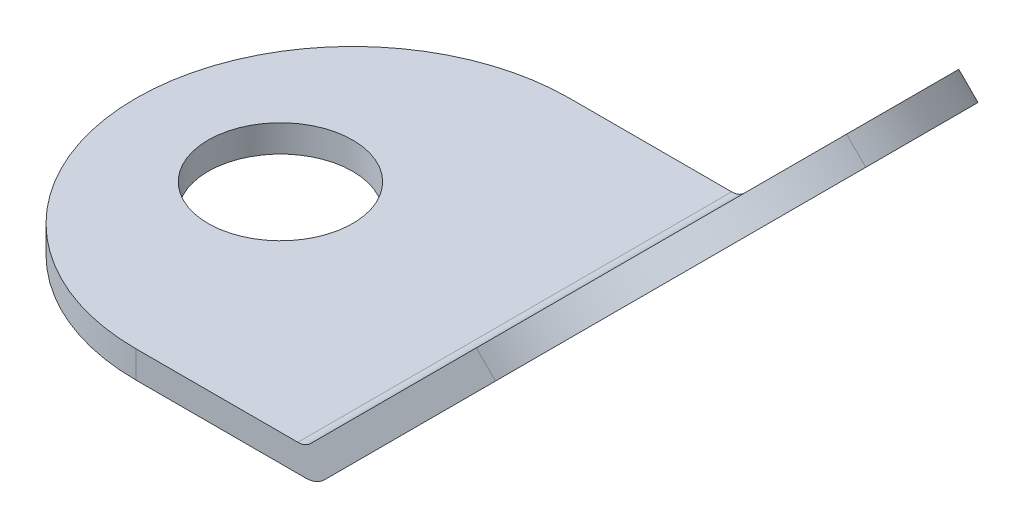
ISO-10303-21;
HEADER;
FILE_DESCRIPTION(('STEP AP214'),'2;1');
FILE_NAME('part.step','',(''),(''),'','','');
FILE_SCHEMA(('AUTOMOTIVE_DESIGN { 1 0 10303 214 1 1 1 1 }'));
ENDSEC;
DATA;
#1=APPLICATION_CONTEXT('core data for automotive mechanical design processes');
#2=APPLICATION_PROTOCOL_DEFINITION('international standard','automotive_design',2000,#1);
#3=PRODUCT_CONTEXT('',#1,'mechanical');
#4=PRODUCT('Part','Part','',(#3));
#5=PRODUCT_RELATED_PRODUCT_CATEGORY('part','',(#4));
#6=PRODUCT_DEFINITION_FORMATION('','',#4);
#7=PRODUCT_DEFINITION_CONTEXT('part definition',#1,'design');
#8=PRODUCT_DEFINITION('design','',#6,#7);
#9=PRODUCT_DEFINITION_SHAPE('','',#8);
#10=(LENGTH_UNIT() NAMED_UNIT(*) SI_UNIT(.MILLI.,.METRE.));
#11=(NAMED_UNIT(*) PLANE_ANGLE_UNIT() SI_UNIT($,.RADIAN.));
#12=(NAMED_UNIT(*) SI_UNIT($,.STERADIAN.) SOLID_ANGLE_UNIT());
#13=UNCERTAINTY_MEASURE_WITH_UNIT(LENGTH_MEASURE(1.E-05),#10,'distance_accuracy_value','');
#14=(GEOMETRIC_REPRESENTATION_CONTEXT(3) GLOBAL_UNCERTAINTY_ASSIGNED_CONTEXT((#13)) GLOBAL_UNIT_ASSIGNED_CONTEXT((#10,
#11,#12)) REPRESENTATION_CONTEXT('',''));
#15=CARTESIAN_POINT('',(0.,0.,0.));
#16=DIRECTION('',(0.,0.,1.));
#17=DIRECTION('',(1.,0.,0.));
#18=AXIS2_PLACEMENT_3D('',#15,#16,#17);
#19=CARTESIAN_POINT('',(0.,0.75,6.));
#20=DIRECTION('',(0.,-1.,0.));
#21=DIRECTION('',(1.,0.,0.));
#22=AXIS2_PLACEMENT_3D('',#19,#20,#21);
#23=PLANE('',#22);
#24=CARTESIAN_POINT('',(-7.,0.749999999999999,0.));
#25=DIRECTION('',(0.,1.,0.));
#26=DIRECTION('',(-1.,0.,0.));
#27=AXIS2_PLACEMENT_3D('',#24,#25,#26);
#28=CIRCLE('',#27,2.);
#29=CARTESIAN_POINT('',(-9.,0.749999999999999,0.));
#30=VERTEX_POINT('',#29);
#31=EDGE_CURVE('E190',#30,#30,#28,.T.);
#32=ORIENTED_EDGE('',*,*,#31,.F.);
#33=EDGE_LOOP('',(#32));
#34=FACE_BOUND('',#33,.T.);
#35=DIRECTION('',(-1.,0.,0.));
#36=VECTOR('',#35,1.);
#37=CARTESIAN_POINT('',(0.,0.75,6.));
#38=LINE('',#37,#36);
#39=CARTESIAN_POINT('',(-0.517766952966369,0.75,6.));
#40=VERTEX_POINT('',#39);
#41=CARTESIAN_POINT('',(-5.,0.749999999999999,6.));
#42=VERTEX_POINT('',#41);
#43=EDGE_CURVE('E199',#40,#42,#38,.T.);
#44=ORIENTED_EDGE('',*,*,#43,.F.);
#45=DIRECTION('',(0.,0.,-1.));
#46=VECTOR('',#45,1.);
#47=CARTESIAN_POINT('',(-0.517766952966369,0.75,-6.));
#48=LINE('',#47,#46);
#49=CARTESIAN_POINT('',(-0.517766952966369,0.75,-6.));
#50=VERTEX_POINT('',#49);
#51=EDGE_CURVE('E286',#40,#50,#48,.T.);
#52=ORIENTED_EDGE('',*,*,#51,.T.);
#53=DIRECTION('',(-1.,0.,0.));
#54=VECTOR('',#53,1.);
#55=CARTESIAN_POINT('',(0.,0.75,-6.));
#56=LINE('',#55,#54);
#57=CARTESIAN_POINT('',(-5.,0.749999999999999,-6.));
#58=VERTEX_POINT('',#57);
#59=EDGE_CURVE('E214',#50,#58,#56,.T.);
#60=ORIENTED_EDGE('',*,*,#59,.T.);
#61=CARTESIAN_POINT('',(-5.,0.749999999999999,0.));
#62=DIRECTION('',(0.,-1.,0.));
#63=DIRECTION('',(1.,0.,0.));
#64=AXIS2_PLACEMENT_3D('',#61,#62,#63);
#65=CIRCLE('',#64,6.);
#66=CARTESIAN_POINT('',(-11.,0.749999999999999,0.));
#67=VERTEX_POINT('',#66);
#68=EDGE_CURVE('E213',#58,#67,#65,.F.);
#69=ORIENTED_EDGE('',*,*,#68,.T.);
#70=CARTESIAN_POINT('',(-5.,0.749999999999999,0.));
#71=DIRECTION('',(0.,-1.,0.));
#72=DIRECTION('',(1.,0.,0.));
#73=AXIS2_PLACEMENT_3D('',#70,#71,#72);
#74=CIRCLE('',#73,6.);
#75=EDGE_CURVE('E229',#67,#42,#74,.F.);
#76=ORIENTED_EDGE('',*,*,#75,.T.);
#77=EDGE_LOOP('',(#44,#52,#60,#69,#76));
#78=FACE_BOUND('',#77,.T.);
#79=ADVANCED_FACE('F39',(#34,#78),#23,.F.);
#80=CARTESIAN_POINT('',(0.,0.,6.));
#81=DIRECTION('',(0.,-1.,0.));
#82=DIRECTION('',(1.,0.,0.));
#83=AXIS2_PLACEMENT_3D('',#80,#81,#82);
#84=PLANE('',#83);
#85=CARTESIAN_POINT('',(-7.,0.,0.));
#86=DIRECTION('',(0.,-1.,0.));
#87=DIRECTION('',(1.,0.,0.));
#88=AXIS2_PLACEMENT_3D('',#85,#86,#87);
#89=CIRCLE('',#88,2.);
#90=CARTESIAN_POINT('',(-5.,0.,0.));
#91=VERTEX_POINT('',#90);
#92=EDGE_CURVE('E194',#91,#91,#89,.F.);
#93=ORIENTED_EDGE('',*,*,#92,.T.);
#94=EDGE_LOOP('',(#93));
#95=FACE_BOUND('',#94,.T.);
#96=DIRECTION('',(-1.,0.,0.));
#97=VECTOR('',#96,1.);
#98=CARTESIAN_POINT('',(0.,0.,-6.));
#99=LINE('',#98,#97);
#100=CARTESIAN_POINT('',(-0.31066017177982,0.,-6.));
#101=VERTEX_POINT('',#100);
#102=CARTESIAN_POINT('',(-5.,0.,-6.));
#103=VERTEX_POINT('',#102);
#104=EDGE_CURVE('E217',#101,#103,#99,.T.);
#105=ORIENTED_EDGE('',*,*,#104,.F.);
#106=DIRECTION('',(0.,0.,-1.));
#107=VECTOR('',#106,1.);
#108=CARTESIAN_POINT('',(-0.31066017177982,0.,6.));
#109=LINE('',#108,#107);
#110=CARTESIAN_POINT('',(-0.31066017177982,0.,6.));
#111=VERTEX_POINT('',#110);
#112=EDGE_CURVE('E280',#101,#111,#109,.F.);
#113=ORIENTED_EDGE('',*,*,#112,.T.);
#114=DIRECTION('',(-1.,0.,0.));
#115=VECTOR('',#114,1.);
#116=CARTESIAN_POINT('',(0.,0.,6.));
#117=LINE('',#116,#115);
#118=CARTESIAN_POINT('',(-5.,0.,6.));
#119=VERTEX_POINT('',#118);
#120=EDGE_CURVE('E202',#111,#119,#117,.T.);
#121=ORIENTED_EDGE('',*,*,#120,.T.);
#122=CARTESIAN_POINT('',(-5.,0.,0.));
#123=DIRECTION('',(0.,-1.,0.));
#124=DIRECTION('',(1.,0.,0.));
#125=AXIS2_PLACEMENT_3D('',#122,#123,#124);
#126=CIRCLE('',#125,6.);
#127=CARTESIAN_POINT('',(-11.,0.,0.));
#128=VERTEX_POINT('',#127);
#129=EDGE_CURVE('E244',#119,#128,#126,.T.);
#130=ORIENTED_EDGE('',*,*,#129,.T.);
#131=CARTESIAN_POINT('',(-5.,0.,0.));
#132=DIRECTION('',(0.,-1.,0.));
#133=DIRECTION('',(1.,0.,0.));
#134=AXIS2_PLACEMENT_3D('',#131,#132,#133);
#135=CIRCLE('',#134,6.);
#136=EDGE_CURVE('E240',#128,#103,#135,.T.);
#137=ORIENTED_EDGE('',*,*,#136,.T.);
#138=EDGE_LOOP('',(#105,#113,#121,#130,#137));
#139=FACE_BOUND('',#138,.T.);
#140=ADVANCED_FACE('F322',(#95,#139),#84,.T.);
#141=CARTESIAN_POINT('',(9.1923881554251,9.19238815542514,6.));
#142=DIRECTION('',(0.707106781186549,-0.707106781186546,0.));
#143=DIRECTION('',(0.707106781186546,0.707106781186549,0.));
#144=AXIS2_PLACEMENT_3D('',#141,#142,#143);
#145=PLANE('',#144);
#146=DIRECTION('',(-0.707106781186546,-0.707106781186549,0.));
#147=VECTOR('',#146,1.);
#148=CARTESIAN_POINT('',(6.36396103067891,6.36396103067894,-2.));
#149=LINE('',#148,#147);
#150=CARTESIAN_POINT('',(6.36396103067891,6.36396103067894,-2.));
#151=VERTEX_POINT('',#150);
#152=CARTESIAN_POINT('',(2.47487373415291,2.47487373415292,-2.));
#153=VERTEX_POINT('',#152);
#154=EDGE_CURVE('E156',#151,#153,#149,.T.);
#155=ORIENTED_EDGE('',*,*,#154,.T.);
#156=CARTESIAN_POINT('',(2.47487373415291,2.47487373415292,0.));
#157=DIRECTION('',(0.707106781186549,-0.707106781186546,0.));
#158=DIRECTION('',(0.707106781186546,0.707106781186549,0.));
#159=AXIS2_PLACEMENT_3D('',#156,#157,#158);
#160=CIRCLE('',#159,2.);
#161=CARTESIAN_POINT('',(2.47487373415291,2.47487373415292,2.));
#162=VERTEX_POINT('',#161);
#163=EDGE_CURVE('E141',#153,#162,#160,.F.);
#164=ORIENTED_EDGE('',*,*,#163,.T.);
#165=DIRECTION('',(0.707106781186546,0.707106781186549,0.));
#166=VECTOR('',#165,1.);
#167=CARTESIAN_POINT('',(6.36396103067891,6.36396103067894,2.));
#168=LINE('',#167,#166);
#169=CARTESIAN_POINT('',(6.36396103067891,6.36396103067894,2.));
#170=VERTEX_POINT('',#169);
#171=EDGE_CURVE('E180',#162,#170,#168,.T.);
#172=ORIENTED_EDGE('',*,*,#171,.T.);
#173=CARTESIAN_POINT('',(6.36396103067891,6.36396103067894,0.));
#174=DIRECTION('',(0.707106781186549,-0.707106781186546,0.));
#175=DIRECTION('',(0.707106781186546,0.707106781186549,0.));
#176=AXIS2_PLACEMENT_3D('',#173,#174,#175);
#177=CIRCLE('',#176,2.);
#178=EDGE_CURVE('E165',#170,#151,#177,.F.);
#179=ORIENTED_EDGE('',*,*,#178,.T.);
#180=EDGE_LOOP('',(#155,#164,#172,#179));
#181=FACE_BOUND('',#180,.T.);
#182=DIRECTION('',(-0.707106781186546,-0.707106781186549,0.));
#183=VECTOR('',#182,1.);
#184=CARTESIAN_POINT('',(9.1923881554251,9.19238815542514,6.));
#185=LINE('',#184,#183);
#186=CARTESIAN_POINT('',(4.94974746830582,4.94974746830584,6.));
#187=VERTEX_POINT('',#186);
#188=CARTESIAN_POINT('',(0.219669914110094,0.219669914110094,6.));
#189=VERTEX_POINT('',#188);
#190=EDGE_CURVE('E206',#187,#189,#185,.T.);
#191=ORIENTED_EDGE('',*,*,#190,.T.);
#192=DIRECTION('',(0.,0.,-1.));
#193=VECTOR('',#192,1.);
#194=CARTESIAN_POINT('',(0.219669914110092,0.219669914110092,6.));
#195=LINE('',#194,#193);
#196=CARTESIAN_POINT('',(0.219669914110094,0.219669914110094,-6.));
#197=VERTEX_POINT('',#196);
#198=EDGE_CURVE('E267',#189,#197,#195,.T.);
#199=ORIENTED_EDGE('',*,*,#198,.T.);
#200=DIRECTION('',(-0.707106781186546,-0.707106781186549,0.));
#201=VECTOR('',#200,1.);
#202=CARTESIAN_POINT('',(9.1923881554251,9.19238815542514,-6.));
#203=LINE('',#202,#201);
#204=CARTESIAN_POINT('',(4.94974746830582,4.94974746830584,-6.));
#205=VERTEX_POINT('',#204);
#206=EDGE_CURVE('E221',#205,#197,#203,.T.);
#207=ORIENTED_EDGE('',*,*,#206,.F.);
#208=CARTESIAN_POINT('',(4.94974746830582,4.94974746830584,0.));
#209=DIRECTION('',(0.707106781186549,-0.707106781186546,0.));
#210=DIRECTION('',(0.707106781186546,0.707106781186549,0.));
#211=AXIS2_PLACEMENT_3D('',#208,#209,#210);
#212=CIRCLE('',#211,6.);
#213=CARTESIAN_POINT('',(9.1923881554251,9.19238815542514,0.));
#214=VERTEX_POINT('',#213);
#215=EDGE_CURVE('E258',#205,#214,#212,.T.);
#216=ORIENTED_EDGE('',*,*,#215,.T.);
#217=CARTESIAN_POINT('',(4.94974746830582,4.94974746830584,0.));
#218=DIRECTION('',(0.707106781186549,-0.707106781186546,0.));
#219=DIRECTION('',(0.707106781186546,0.707106781186549,0.));
#220=AXIS2_PLACEMENT_3D('',#217,#218,#219);
#221=CIRCLE('',#220,6.);
#222=EDGE_CURVE('E255',#214,#187,#221,.T.);
#223=ORIENTED_EDGE('',*,*,#222,.T.);
#224=EDGE_LOOP('',(#191,#199,#207,#216,#223));
#225=FACE_BOUND('',#224,.T.);
#226=ADVANCED_FACE('F163',(#181,#225),#145,.T.);
#227=CARTESIAN_POINT('',(8.66205806953518,9.72271824131505,6.));
#228=DIRECTION('',(0.707106781186549,-0.707106781186546,0.));
#229=DIRECTION('',(0.707106781186546,0.707106781186549,0.));
#230=AXIS2_PLACEMENT_3D('',#227,#228,#229);
#231=PLANE('',#230);
#232=CARTESIAN_POINT('',(1.944543648263,3.00520382004283,0.));
#233=DIRECTION('',(-0.707106781186549,0.707106781186546,0.));
#234=DIRECTION('',(-0.707106781186546,-0.707106781186549,0.));
#235=AXIS2_PLACEMENT_3D('',#232,#233,#234);
#236=CIRCLE('',#235,2.);
#237=CARTESIAN_POINT('',(1.944543648263,3.00520382004283,-2.));
#238=VERTEX_POINT('',#237);
#239=CARTESIAN_POINT('',(1.944543648263,3.00520382004283,2.));
#240=VERTEX_POINT('',#239);
#241=EDGE_CURVE('E170',#238,#240,#236,.T.);
#242=ORIENTED_EDGE('',*,*,#241,.F.);
#243=DIRECTION('',(-0.707106781186546,-0.707106781186549,0.));
#244=VECTOR('',#243,1.);
#245=CARTESIAN_POINT('',(5.833630944789,6.89429111656885,-2.));
#246=LINE('',#245,#244);
#247=CARTESIAN_POINT('',(5.833630944789,6.89429111656885,-2.));
#248=VERTEX_POINT('',#247);
#249=EDGE_CURVE('E159',#248,#238,#246,.T.);
#250=ORIENTED_EDGE('',*,*,#249,.F.);
#251=CARTESIAN_POINT('',(5.833630944789,6.89429111656885,0.));
#252=DIRECTION('',(-0.707106781186549,0.707106781186546,0.));
#253=DIRECTION('',(-0.707106781186546,-0.707106781186549,0.));
#254=AXIS2_PLACEMENT_3D('',#251,#252,#253);
#255=CIRCLE('',#254,2.);
#256=CARTESIAN_POINT('',(5.833630944789,6.89429111656885,2.));
#257=VERTEX_POINT('',#256);
#258=EDGE_CURVE('E174',#257,#248,#255,.T.);
#259=ORIENTED_EDGE('',*,*,#258,.F.);
#260=DIRECTION('',(0.707106781186546,0.707106781186549,0.));
#261=VECTOR('',#260,1.);
#262=CARTESIAN_POINT('',(5.833630944789,6.89429111656885,2.));
#263=LINE('',#262,#261);
#264=EDGE_CURVE('E167',#240,#257,#263,.T.);
#265=ORIENTED_EDGE('',*,*,#264,.F.);
#266=EDGE_LOOP('',(#242,#250,#259,#265));
#267=FACE_BOUND('',#266,.T.);
#268=DIRECTION('',(-0.707106781186546,-0.707106781186549,0.));
#269=VECTOR('',#268,1.);
#270=CARTESIAN_POINT('',(8.66205806953518,9.72271824131505,-6.));
#271=LINE('',#270,#269);
#272=CARTESIAN_POINT('',(4.41941738241591,5.48007755419575,-6.));
#273=VERTEX_POINT('',#272);
#274=CARTESIAN_POINT('',(-0.164213562373096,0.896446609406727,-6.));
#275=VERTEX_POINT('',#274);
#276=EDGE_CURVE('E203',#273,#275,#271,.T.);
#277=ORIENTED_EDGE('',*,*,#276,.T.);
#278=DIRECTION('',(0.,0.,-1.));
#279=VECTOR('',#278,1.);
#280=CARTESIAN_POINT('',(-0.164213562373094,0.896446609406727,6.));
#281=LINE('',#280,#279);
#282=CARTESIAN_POINT('',(-0.164213562373096,0.896446609406727,6.));
#283=VERTEX_POINT('',#282);
#284=EDGE_CURVE('E55',#275,#283,#281,.F.);
#285=ORIENTED_EDGE('',*,*,#284,.T.);
#286=DIRECTION('',(-0.707106781186546,-0.707106781186549,0.));
#287=VECTOR('',#286,1.);
#288=CARTESIAN_POINT('',(8.66205806953518,9.72271824131505,6.));
#289=LINE('',#288,#287);
#290=CARTESIAN_POINT('',(4.41941738241591,5.48007755419575,6.));
#291=VERTEX_POINT('',#290);
#292=EDGE_CURVE('E210',#291,#283,#289,.T.);
#293=ORIENTED_EDGE('',*,*,#292,.F.);
#294=CARTESIAN_POINT('',(4.41941738241591,5.48007755419575,0.));
#295=DIRECTION('',(0.707106781186549,-0.707106781186546,0.));
#296=DIRECTION('',(0.707106781186546,0.707106781186549,0.));
#297=AXIS2_PLACEMENT_3D('',#294,#295,#296);
#298=CIRCLE('',#297,6.);
#299=CARTESIAN_POINT('',(8.66205806953518,9.72271824131505,0.));
#300=VERTEX_POINT('',#299);
#301=EDGE_CURVE('E261',#291,#300,#298,.F.);
#302=ORIENTED_EDGE('',*,*,#301,.T.);
#303=CARTESIAN_POINT('',(4.41941738241591,5.48007755419575,0.));
#304=DIRECTION('',(0.707106781186549,-0.707106781186546,0.));
#305=DIRECTION('',(0.707106781186546,0.707106781186549,0.));
#306=AXIS2_PLACEMENT_3D('',#303,#304,#305);
#307=CIRCLE('',#306,6.);
#308=EDGE_CURVE('E264',#300,#273,#307,.F.);
#309=ORIENTED_EDGE('',*,*,#308,.T.);
#310=EDGE_LOOP('',(#277,#285,#293,#302,#309));
#311=FACE_BOUND('',#310,.T.);
#312=ADVANCED_FACE('F353',(#267,#311),#231,.F.);
#313=CARTESIAN_POINT('',(0.,0.,6.));
#314=DIRECTION('',(0.,0.,-1.));
#315=DIRECTION('',(-1.,0.,0.));
#316=AXIS2_PLACEMENT_3D('',#313,#314,#315);
#317=PLANE('',#316);
#318=ORIENTED_EDGE('',*,*,#120,.F.);
#319=CARTESIAN_POINT('',(-0.31066017177982,0.750000000000001,6.));
#320=DIRECTION('',(0.,0.,-1.));
#321=DIRECTION('',(-1.,0.,0.));
#322=AXIS2_PLACEMENT_3D('',#319,#320,#321);
#323=CIRCLE('',#322,0.75);
#324=EDGE_CURVE('E283',#111,#189,#323,.F.);
#325=ORIENTED_EDGE('',*,*,#324,.T.);
#326=ORIENTED_EDGE('',*,*,#190,.F.);
#327=DIRECTION('',(0.70710678118655,-0.707106781186545,0.));
#328=VECTOR('',#327,1.);
#329=CARTESIAN_POINT('',(4.41941738241591,5.48007755419575,6.));
#330=LINE('',#329,#328);
#331=EDGE_CURVE('E233',#187,#291,#330,.F.);
#332=ORIENTED_EDGE('',*,*,#331,.T.);
#333=ORIENTED_EDGE('',*,*,#292,.T.);
#334=CARTESIAN_POINT('',(-0.517766952966369,1.25,6.));
#335=DIRECTION('',(0.,0.,-1.));
#336=DIRECTION('',(-1.,0.,0.));
#337=AXIS2_PLACEMENT_3D('',#334,#335,#336);
#338=CIRCLE('',#337,0.5);
#339=EDGE_CURVE('E11',#283,#40,#338,.T.);
#340=ORIENTED_EDGE('',*,*,#339,.T.);
#341=ORIENTED_EDGE('',*,*,#43,.T.);
#342=DIRECTION('',(0.,1.,0.));
#343=VECTOR('',#342,1.);
#344=CARTESIAN_POINT('',(-5.,0.,6.));
#345=LINE('',#344,#343);
#346=EDGE_CURVE('E236',#42,#119,#345,.F.);
#347=ORIENTED_EDGE('',*,*,#346,.T.);
#348=EDGE_LOOP('',(#318,#325,#326,#332,#333,#340,#341,#347));
#349=FACE_BOUND('',#348,.T.);
#350=ADVANCED_FACE('F312',(#349),#317,.F.);
#351=CARTESIAN_POINT('',(0.,0.,-6.));
#352=DIRECTION('',(0.,0.,-1.));
#353=DIRECTION('',(-1.,0.,0.));
#354=AXIS2_PLACEMENT_3D('',#351,#352,#353);
#355=PLANE('',#354);
#356=ORIENTED_EDGE('',*,*,#206,.T.);
#357=CARTESIAN_POINT('',(-0.31066017177982,0.750000000000001,-6.));
#358=DIRECTION('',(0.,0.,-1.));
#359=DIRECTION('',(-1.,0.,0.));
#360=AXIS2_PLACEMENT_3D('',#357,#358,#359);
#361=CIRCLE('',#360,0.75);
#362=EDGE_CURVE('E277',#197,#101,#361,.T.);
#363=ORIENTED_EDGE('',*,*,#362,.T.);
#364=ORIENTED_EDGE('',*,*,#104,.T.);
#365=DIRECTION('',(0.,1.,0.));
#366=VECTOR('',#365,1.);
#367=CARTESIAN_POINT('',(-5.,0.,-6.));
#368=LINE('',#367,#366);
#369=EDGE_CURVE('E251',#103,#58,#368,.T.);
#370=ORIENTED_EDGE('',*,*,#369,.T.);
#371=ORIENTED_EDGE('',*,*,#59,.F.);
#372=CARTESIAN_POINT('',(-0.517766952966369,1.25,-6.));
#373=DIRECTION('',(0.,0.,-1.));
#374=DIRECTION('',(-1.,0.,0.));
#375=AXIS2_PLACEMENT_3D('',#372,#373,#374);
#376=CIRCLE('',#375,0.5);
#377=EDGE_CURVE('E48',#50,#275,#376,.F.);
#378=ORIENTED_EDGE('',*,*,#377,.T.);
#379=ORIENTED_EDGE('',*,*,#276,.F.);
#380=DIRECTION('',(0.70710678118655,-0.707106781186545,0.));
#381=VECTOR('',#380,1.);
#382=CARTESIAN_POINT('',(4.94974746830582,4.94974746830585,-6.));
#383=LINE('',#382,#381);
#384=EDGE_CURVE('E247',#273,#205,#383,.T.);
#385=ORIENTED_EDGE('',*,*,#384,.T.);
#386=EDGE_LOOP('',(#356,#363,#364,#370,#371,#378,#379,#385));
#387=FACE_BOUND('',#386,.T.);
#388=ADVANCED_FACE('F297',(#387),#355,.T.);
#389=CARTESIAN_POINT('',(-5.,0.,0.));
#390=DIRECTION('',(0.,1.,0.));
#391=DIRECTION('',(0.,0.,1.));
#392=AXIS2_PLACEMENT_3D('',#389,#390,#391);
#393=CYLINDRICAL_SURFACE('',#392,6.);
#394=ORIENTED_EDGE('',*,*,#369,.F.);
#395=ORIENTED_EDGE('',*,*,#136,.F.);
#396=DIRECTION('',(0.,1.,0.));
#397=VECTOR('',#396,1.);
#398=CARTESIAN_POINT('',(-11.,0.,0.));
#399=LINE('',#398,#397);
#400=EDGE_CURVE('E218',#67,#128,#399,.F.);
#401=ORIENTED_EDGE('',*,*,#400,.F.);
#402=ORIENTED_EDGE('',*,*,#68,.F.);
#403=EDGE_LOOP('',(#394,#395,#401,#402));
#404=FACE_BOUND('',#403,.T.);
#405=ADVANCED_FACE('F304',(#404),#393,.T.);
#406=CARTESIAN_POINT('',(-5.,0.,0.));
#407=DIRECTION('',(0.,-1.,0.));
#408=DIRECTION('',(0.,0.,-1.));
#409=AXIS2_PLACEMENT_3D('',#406,#407,#408);
#410=CYLINDRICAL_SURFACE('',#409,6.);
#411=ORIENTED_EDGE('',*,*,#129,.F.);
#412=ORIENTED_EDGE('',*,*,#346,.F.);
#413=ORIENTED_EDGE('',*,*,#75,.F.);
#414=ORIENTED_EDGE('',*,*,#400,.T.);
#415=EDGE_LOOP('',(#411,#412,#413,#414));
#416=FACE_BOUND('',#415,.T.);
#417=ADVANCED_FACE('F309',(#416),#410,.T.);
#418=CARTESIAN_POINT('',(4.41941738241591,5.48007755419575,0.));
#419=DIRECTION('',(-0.70710678118655,0.707106781186545,0.));
#420=DIRECTION('',(-0.707106781186545,-0.70710678118655,0.));
#421=AXIS2_PLACEMENT_3D('',#418,#419,#420);
#422=CYLINDRICAL_SURFACE('',#421,6.);
#423=DIRECTION('',(0.70710678118655,-0.707106781186545,0.));
#424=VECTOR('',#423,1.);
#425=CARTESIAN_POINT('',(9.1923881554251,9.19238815542514,0.));
#426=LINE('',#425,#424);
#427=EDGE_CURVE('E198',#300,#214,#426,.T.);
#428=ORIENTED_EDGE('',*,*,#427,.F.);
#429=ORIENTED_EDGE('',*,*,#301,.F.);
#430=ORIENTED_EDGE('',*,*,#331,.F.);
#431=ORIENTED_EDGE('',*,*,#222,.F.);
#432=EDGE_LOOP('',(#428,#429,#430,#431));
#433=FACE_BOUND('',#432,.T.);
#434=ADVANCED_FACE('F335',(#433),#422,.T.);
#435=CARTESIAN_POINT('',(4.94974746830582,4.94974746830585,0.));
#436=DIRECTION('',(0.70710678118655,-0.707106781186545,0.));
#437=DIRECTION('',(0.707106781186545,0.70710678118655,0.));
#438=AXIS2_PLACEMENT_3D('',#435,#436,#437);
#439=CYLINDRICAL_SURFACE('',#438,6.);
#440=ORIENTED_EDGE('',*,*,#308,.F.);
#441=ORIENTED_EDGE('',*,*,#427,.T.);
#442=ORIENTED_EDGE('',*,*,#215,.F.);
#443=ORIENTED_EDGE('',*,*,#384,.F.);
#444=EDGE_LOOP('',(#440,#441,#442,#443));
#445=FACE_BOUND('',#444,.T.);
#446=ADVANCED_FACE('F338',(#445),#439,.T.);
#447=CARTESIAN_POINT('',(-7.,-5.65685424949238,0.));
#448=DIRECTION('',(0.,1.,0.));
#449=DIRECTION('',(-1.,0.,0.));
#450=AXIS2_PLACEMENT_3D('',#447,#448,#449);
#451=CYLINDRICAL_SURFACE('',#450,2.);
#452=ORIENTED_EDGE('',*,*,#31,.T.);
#453=EDGE_LOOP('',(#452));
#454=FACE_BOUND('',#453,.T.);
#455=ORIENTED_EDGE('',*,*,#92,.F.);
#456=EDGE_LOOP('',(#455));
#457=FACE_BOUND('',#456,.T.);
#458=ADVANCED_FACE('F341',(#454,#457),#451,.F.);
#459=CARTESIAN_POINT('',(13.6526508992356,-0.924728837877666,-2.));
#460=DIRECTION('',(0.,0.,-1.));
#461=DIRECTION('',(0.,1.,0.));
#462=AXIS2_PLACEMENT_3D('',#459,#460,#461);
#463=PLANE('',#462);
#464=DIRECTION('',(-0.707106781186549,0.707106781186546,0.));
#465=VECTOR('',#464,1.);
#466=CARTESIAN_POINT('',(13.6526508992356,-0.924728837877666,-2.));
#467=LINE('',#466,#465);
#468=EDGE_CURVE('E178',#151,#248,#467,.T.);
#469=ORIENTED_EDGE('',*,*,#468,.T.);
#470=ORIENTED_EDGE('',*,*,#249,.T.);
#471=DIRECTION('',(-0.707106781186549,0.707106781186546,0.));
#472=VECTOR('',#471,1.);
#473=CARTESIAN_POINT('',(9.76356360270955,-4.81381613440369,-2.));
#474=LINE('',#473,#472);
#475=EDGE_CURVE('E145',#153,#238,#474,.T.);
#476=ORIENTED_EDGE('',*,*,#475,.F.);
#477=ORIENTED_EDGE('',*,*,#154,.F.);
#478=EDGE_LOOP('',(#469,#470,#476,#477));
#479=FACE_BOUND('',#478,.T.);
#480=ADVANCED_FACE('F155',(#479),#463,.F.);
#481=CARTESIAN_POINT('',(9.76356360270955,-4.81381613440369,0.));
#482=DIRECTION('',(-0.707106781186549,0.707106781186546,0.));
#483=DIRECTION('',(-0.707106781186546,-0.707106781186549,0.));
#484=AXIS2_PLACEMENT_3D('',#481,#482,#483);
#485=CYLINDRICAL_SURFACE('',#484,2.);
#486=ORIENTED_EDGE('',*,*,#475,.T.);
#487=ORIENTED_EDGE('',*,*,#241,.T.);
#488=DIRECTION('',(-0.707106781186549,0.707106781186546,0.));
#489=VECTOR('',#488,1.);
#490=CARTESIAN_POINT('',(9.76356360270955,-4.81381613440369,2.));
#491=LINE('',#490,#489);
#492=EDGE_CURVE('E147',#162,#240,#491,.T.);
#493=ORIENTED_EDGE('',*,*,#492,.F.);
#494=ORIENTED_EDGE('',*,*,#163,.F.);
#495=EDGE_LOOP('',(#486,#487,#493,#494));
#496=FACE_BOUND('',#495,.T.);
#497=ADVANCED_FACE('F143',(#496),#485,.F.);
#498=CARTESIAN_POINT('',(13.6526508992356,-0.924728837877666,2.));
#499=DIRECTION('',(0.,0.,1.));
#500=DIRECTION('',(0.,-1.,0.));
#501=AXIS2_PLACEMENT_3D('',#498,#499,#500);
#502=PLANE('',#501);
#503=ORIENTED_EDGE('',*,*,#492,.T.);
#504=ORIENTED_EDGE('',*,*,#264,.T.);
#505=DIRECTION('',(-0.707106781186549,0.707106781186546,0.));
#506=VECTOR('',#505,1.);
#507=CARTESIAN_POINT('',(13.6526508992356,-0.924728837877666,2.));
#508=LINE('',#507,#506);
#509=EDGE_CURVE('E179',#170,#257,#508,.T.);
#510=ORIENTED_EDGE('',*,*,#509,.F.);
#511=ORIENTED_EDGE('',*,*,#171,.F.);
#512=EDGE_LOOP('',(#503,#504,#510,#511));
#513=FACE_BOUND('',#512,.T.);
#514=ADVANCED_FACE('F377',(#513),#502,.F.);
#515=CARTESIAN_POINT('',(13.6526508992356,-0.924728837877666,0.));
#516=DIRECTION('',(-0.707106781186549,0.707106781186546,0.));
#517=DIRECTION('',(-0.707106781186546,-0.707106781186549,0.));
#518=AXIS2_PLACEMENT_3D('',#515,#516,#517);
#519=CYLINDRICAL_SURFACE('',#518,2.);
#520=ORIENTED_EDGE('',*,*,#509,.T.);
#521=ORIENTED_EDGE('',*,*,#258,.T.);
#522=ORIENTED_EDGE('',*,*,#468,.F.);
#523=ORIENTED_EDGE('',*,*,#178,.F.);
#524=EDGE_LOOP('',(#520,#521,#522,#523));
#525=FACE_BOUND('',#524,.T.);
#526=ADVANCED_FACE('F319',(#525),#519,.F.);
#527=CARTESIAN_POINT('',(-0.31066017177982,0.750000000000001,6.));
#528=DIRECTION('',(0.,0.,-1.));
#529=DIRECTION('',(-1.,0.,0.));
#530=AXIS2_PLACEMENT_3D('',#527,#528,#529);
#531=CYLINDRICAL_SURFACE('',#530,0.75);
#532=ORIENTED_EDGE('',*,*,#324,.F.);
#533=ORIENTED_EDGE('',*,*,#112,.F.);
#534=ORIENTED_EDGE('',*,*,#362,.F.);
#535=ORIENTED_EDGE('',*,*,#198,.F.);
#536=EDGE_LOOP('',(#532,#533,#534,#535));
#537=FACE_BOUND('',#536,.T.);
#538=ADVANCED_FACE('F315',(#537),#531,.T.);
#539=CARTESIAN_POINT('',(-0.517766952966369,1.25,6.));
#540=DIRECTION('',(0.,0.,1.));
#541=DIRECTION('',(1.,0.,0.));
#542=AXIS2_PLACEMENT_3D('',#539,#540,#541);
#543=CYLINDRICAL_SURFACE('',#542,0.5);
#544=ORIENTED_EDGE('',*,*,#339,.F.);
#545=ORIENTED_EDGE('',*,*,#284,.F.);
#546=ORIENTED_EDGE('',*,*,#377,.F.);
#547=ORIENTED_EDGE('',*,*,#51,.F.);
#548=EDGE_LOOP('',(#544,#545,#546,#547));
#549=FACE_BOUND('',#548,.T.);
#550=ADVANCED_FACE('F41',(#549),#543,.F.);
#551=CLOSED_SHELL('',(#79,#140,#226,#312,#350,#388,#405,#417,#434,#446,#458,#480,#497,#514,#526,
#538,#550));
#552=MANIFOLD_SOLID_BREP('B2',#551);
#553=ADVANCED_BREP_SHAPE_REPRESENTATION('',(#18,#552),#14);
#554=SHAPE_DEFINITION_REPRESENTATION(#9,#553);
ENDSEC;
END-ISO-10303-21;
